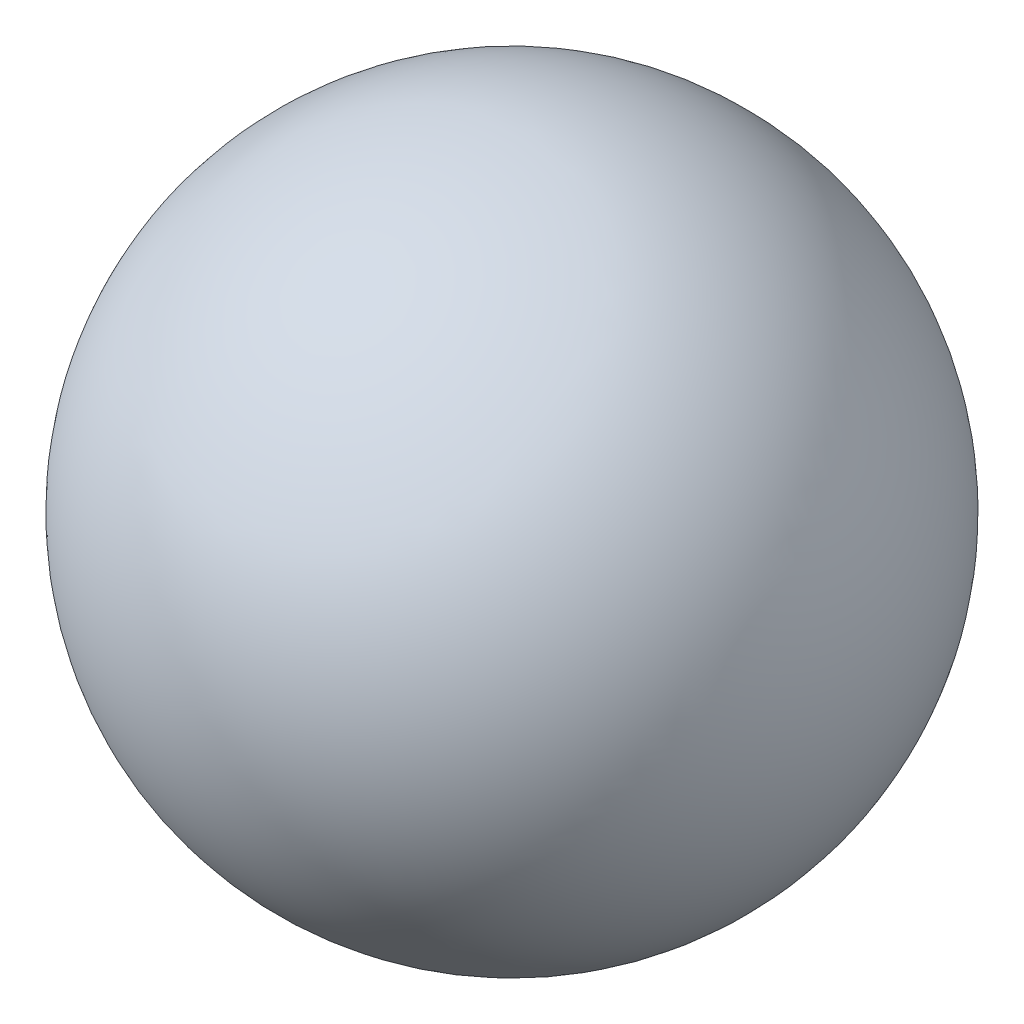
ISO-10303-21;
HEADER;
FILE_DESCRIPTION(('STEP AP214'),'2;1');
FILE_NAME('part.step','',(''),(''),'','','');
FILE_SCHEMA(('AUTOMOTIVE_DESIGN { 1 0 10303 214 1 1 1 1 }'));
ENDSEC;
DATA;
#1=APPLICATION_CONTEXT('core data for automotive mechanical design processes');
#2=APPLICATION_PROTOCOL_DEFINITION('international standard','automotive_design',2000,#1);
#3=PRODUCT_CONTEXT('',#1,'mechanical');
#4=PRODUCT('Part','Part','',(#3));
#5=PRODUCT_RELATED_PRODUCT_CATEGORY('part','',(#4));
#6=PRODUCT_DEFINITION_FORMATION('','',#4);
#7=PRODUCT_DEFINITION_CONTEXT('part definition',#1,'design');
#8=PRODUCT_DEFINITION('design','',#6,#7);
#9=PRODUCT_DEFINITION_SHAPE('','',#8);
#10=(LENGTH_UNIT() NAMED_UNIT(*) SI_UNIT(.MILLI.,.METRE.));
#11=(NAMED_UNIT(*) PLANE_ANGLE_UNIT() SI_UNIT($,.RADIAN.));
#12=(NAMED_UNIT(*) SI_UNIT($,.STERADIAN.) SOLID_ANGLE_UNIT());
#13=UNCERTAINTY_MEASURE_WITH_UNIT(LENGTH_MEASURE(1.E-05),#10,'distance_accuracy_value','');
#14=(GEOMETRIC_REPRESENTATION_CONTEXT(3) GLOBAL_UNCERTAINTY_ASSIGNED_CONTEXT((#13)) GLOBAL_UNIT_ASSIGNED_CONTEXT((#10,
#11,#12)) REPRESENTATION_CONTEXT('',''));
#15=CARTESIAN_POINT('',(0.,0.,0.));
#16=DIRECTION('',(0.,0.,1.));
#17=DIRECTION('',(1.,0.,0.));
#18=AXIS2_PLACEMENT_3D('',#15,#16,#17);
#19=CARTESIAN_POINT('',(150.,0.,0.));
#20=DIRECTION('',(-1.,0.,0.));
#21=DIRECTION('',(0.,1.,0.));
#22=AXIS2_PLACEMENT_3D('',#19,#20,#21);
#23=SPHERICAL_SURFACE('',#22,150.);
#24=CARTESIAN_POINT('',(0.,0.,0.));
#25=VERTEX_POINT('',#24);
#26=VERTEX_LOOP('',#25);
#27=FACE_BOUND('',#26,.T.);
#28=ADVANCED_FACE('F33',(#27),#23,.T.);
#29=CLOSED_SHELL('',(#28));
#30=MANIFOLD_SOLID_BREP('B2',#29);
#31=ADVANCED_BREP_SHAPE_REPRESENTATION('',(#18,#30),#14);
#32=SHAPE_DEFINITION_REPRESENTATION(#9,#31);
ENDSEC;
END-ISO-10303-21;
